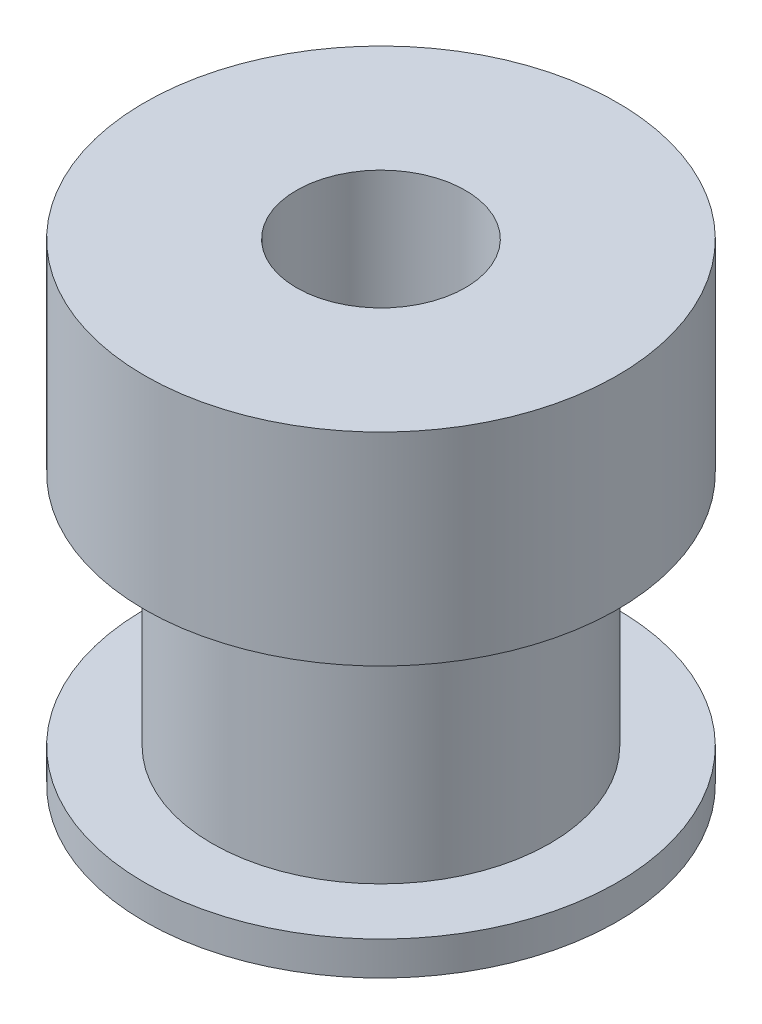
ISO-10303-21;
HEADER;
FILE_DESCRIPTION(('STEP AP214'),'2;1');
FILE_NAME('part.step','',(''),(''),'','','');
FILE_SCHEMA(('AUTOMOTIVE_DESIGN { 1 0 10303 214 1 1 1 1 }'));
ENDSEC;
DATA;
#1=APPLICATION_CONTEXT('core data for automotive mechanical design processes');
#2=APPLICATION_PROTOCOL_DEFINITION('international standard','automotive_design',2000,#1);
#3=PRODUCT_CONTEXT('',#1,'mechanical');
#4=PRODUCT('Part','Part','',(#3));
#5=PRODUCT_RELATED_PRODUCT_CATEGORY('part','',(#4));
#6=PRODUCT_DEFINITION_FORMATION('','',#4);
#7=PRODUCT_DEFINITION_CONTEXT('part definition',#1,'design');
#8=PRODUCT_DEFINITION('design','',#6,#7);
#9=PRODUCT_DEFINITION_SHAPE('','',#8);
#10=(LENGTH_UNIT() NAMED_UNIT(*) SI_UNIT(.MILLI.,.METRE.));
#11=(NAMED_UNIT(*) PLANE_ANGLE_UNIT() SI_UNIT($,.RADIAN.));
#12=(NAMED_UNIT(*) SI_UNIT($,.STERADIAN.) SOLID_ANGLE_UNIT());
#13=UNCERTAINTY_MEASURE_WITH_UNIT(LENGTH_MEASURE(1.E-05),#10,'distance_accuracy_value','');
#14=(GEOMETRIC_REPRESENTATION_CONTEXT(3) GLOBAL_UNCERTAINTY_ASSIGNED_CONTEXT((#13)) GLOBAL_UNIT_ASSIGNED_CONTEXT((#10,
#11,#12)) REPRESENTATION_CONTEXT('',''));
#15=CARTESIAN_POINT('',(0.,0.,0.));
#16=DIRECTION('',(0.,0.,1.));
#17=DIRECTION('',(1.,0.,0.));
#18=AXIS2_PLACEMENT_3D('',#15,#16,#17);
#19=CARTESIAN_POINT('',(0.,1.,0.));
#20=DIRECTION('',(0.,-1.,0.));
#21=DIRECTION('',(0.,0.,-1.));
#22=AXIS2_PLACEMENT_3D('',#19,#20,#21);
#23=CYLINDRICAL_SURFACE('',#22,7.);
#24=CARTESIAN_POINT('',(0.,1.,0.));
#25=DIRECTION('',(0.,1.,0.));
#26=DIRECTION('',(0.,0.,1.));
#27=AXIS2_PLACEMENT_3D('',#24,#25,#26);
#28=CIRCLE('',#27,7.);
#29=CARTESIAN_POINT('',(0.,1.,7.));
#30=VERTEX_POINT('',#29);
#31=EDGE_CURVE('E45',#30,#30,#28,.T.);
#32=ORIENTED_EDGE('',*,*,#31,.F.);
#33=EDGE_LOOP('',(#32));
#34=FACE_BOUND('',#33,.T.);
#35=CARTESIAN_POINT('',(0.,0.,0.));
#36=DIRECTION('',(0.,1.,0.));
#37=DIRECTION('',(0.,0.,1.));
#38=AXIS2_PLACEMENT_3D('',#35,#36,#37);
#39=CIRCLE('',#38,7.);
#40=CARTESIAN_POINT('',(0.,0.,7.));
#41=VERTEX_POINT('',#40);
#42=EDGE_CURVE('E40',#41,#41,#39,.T.);
#43=ORIENTED_EDGE('',*,*,#42,.T.);
#44=EDGE_LOOP('',(#43));
#45=FACE_BOUND('',#44,.T.);
#46=ADVANCED_FACE('F37',(#34,#45),#23,.T.);
#47=CARTESIAN_POINT('',(0.,1.,0.));
#48=DIRECTION('',(0.,1.,0.));
#49=DIRECTION('',(0.,0.,1.));
#50=AXIS2_PLACEMENT_3D('',#47,#48,#49);
#51=PLANE('',#50);
#52=CARTESIAN_POINT('',(0.,1.,0.));
#53=DIRECTION('',(0.,1.,0.));
#54=DIRECTION('',(0.,0.,1.));
#55=AXIS2_PLACEMENT_3D('',#52,#53,#54);
#56=CIRCLE('',#55,5.);
#57=CARTESIAN_POINT('',(0.,1.,5.));
#58=VERTEX_POINT('',#57);
#59=EDGE_CURVE('E10',#58,#58,#56,.T.);
#60=ORIENTED_EDGE('',*,*,#59,.F.);
#61=EDGE_LOOP('',(#60));
#62=FACE_BOUND('',#61,.T.);
#63=ORIENTED_EDGE('',*,*,#31,.T.);
#64=EDGE_LOOP('',(#63));
#65=FACE_BOUND('',#64,.T.);
#66=ADVANCED_FACE('F98',(#62,#65),#51,.T.);
#67=CARTESIAN_POINT('',(0.,0.,0.));
#68=DIRECTION('',(0.,1.,0.));
#69=DIRECTION('',(0.,0.,1.));
#70=AXIS2_PLACEMENT_3D('',#67,#68,#69);
#71=PLANE('',#70);
#72=CARTESIAN_POINT('',(0.,0.,0.));
#73=DIRECTION('',(0.,1.,0.));
#74=DIRECTION('',(0.,0.,1.));
#75=AXIS2_PLACEMENT_3D('',#72,#73,#74);
#76=CIRCLE('',#75,2.5);
#77=CARTESIAN_POINT('',(0.,0.,2.5));
#78=VERTEX_POINT('',#77);
#79=EDGE_CURVE('E61',#78,#78,#76,.F.);
#80=ORIENTED_EDGE('',*,*,#79,.F.);
#81=EDGE_LOOP('',(#80));
#82=FACE_BOUND('',#81,.T.);
#83=ORIENTED_EDGE('',*,*,#42,.F.);
#84=EDGE_LOOP('',(#83));
#85=FACE_BOUND('',#84,.T.);
#86=ADVANCED_FACE('F103',(#82,#85),#71,.F.);
#87=CARTESIAN_POINT('',(0.,8.,0.));
#88=DIRECTION('',(0.,-1.,0.));
#89=DIRECTION('',(0.,0.,-1.));
#90=AXIS2_PLACEMENT_3D('',#87,#88,#89);
#91=CYLINDRICAL_SURFACE('',#90,5.);
#92=CARTESIAN_POINT('',(0.,8.,0.));
#93=DIRECTION('',(0.,1.,0.));
#94=DIRECTION('',(0.,0.,1.));
#95=AXIS2_PLACEMENT_3D('',#92,#93,#94);
#96=CIRCLE('',#95,5.);
#97=CARTESIAN_POINT('',(0.,8.,5.));
#98=VERTEX_POINT('',#97);
#99=EDGE_CURVE('E52',#98,#98,#96,.T.);
#100=ORIENTED_EDGE('',*,*,#99,.F.);
#101=EDGE_LOOP('',(#100));
#102=FACE_BOUND('',#101,.T.);
#103=ORIENTED_EDGE('',*,*,#59,.T.);
#104=EDGE_LOOP('',(#103));
#105=FACE_BOUND('',#104,.T.);
#106=ADVANCED_FACE('F85',(#102,#105),#91,.T.);
#107=CARTESIAN_POINT('',(0.,14.,0.));
#108=DIRECTION('',(0.,-1.,0.));
#109=DIRECTION('',(0.,0.,-1.));
#110=AXIS2_PLACEMENT_3D('',#107,#108,#109);
#111=CYLINDRICAL_SURFACE('',#110,7.);
#112=CARTESIAN_POINT('',(0.,14.,0.));
#113=DIRECTION('',(0.,1.,0.));
#114=DIRECTION('',(0.,0.,1.));
#115=AXIS2_PLACEMENT_3D('',#112,#113,#114);
#116=CIRCLE('',#115,7.);
#117=CARTESIAN_POINT('',(0.,14.,7.));
#118=VERTEX_POINT('',#117);
#119=EDGE_CURVE('E56',#118,#118,#116,.T.);
#120=ORIENTED_EDGE('',*,*,#119,.F.);
#121=EDGE_LOOP('',(#120));
#122=FACE_BOUND('',#121,.T.);
#123=CARTESIAN_POINT('',(0.,8.,0.));
#124=DIRECTION('',(0.,1.,0.));
#125=DIRECTION('',(0.,0.,1.));
#126=AXIS2_PLACEMENT_3D('',#123,#124,#125);
#127=CIRCLE('',#126,7.);
#128=CARTESIAN_POINT('',(0.,8.,7.));
#129=VERTEX_POINT('',#128);
#130=EDGE_CURVE('E57',#129,#129,#127,.T.);
#131=ORIENTED_EDGE('',*,*,#130,.T.);
#132=EDGE_LOOP('',(#131));
#133=FACE_BOUND('',#132,.T.);
#134=ADVANCED_FACE('F79',(#122,#133),#111,.T.);
#135=CARTESIAN_POINT('',(0.,14.,0.));
#136=DIRECTION('',(0.,1.,0.));
#137=DIRECTION('',(0.,0.,1.));
#138=AXIS2_PLACEMENT_3D('',#135,#136,#137);
#139=PLANE('',#138);
#140=CARTESIAN_POINT('',(0.,14.,0.));
#141=DIRECTION('',(0.,1.,0.));
#142=DIRECTION('',(0.,0.,1.));
#143=AXIS2_PLACEMENT_3D('',#140,#141,#142);
#144=CIRCLE('',#143,2.5);
#145=CARTESIAN_POINT('',(0.,14.,2.5));
#146=VERTEX_POINT('',#145);
#147=EDGE_CURVE('E68',#146,#146,#144,.T.);
#148=ORIENTED_EDGE('',*,*,#147,.F.);
#149=EDGE_LOOP('',(#148));
#150=FACE_BOUND('',#149,.T.);
#151=ORIENTED_EDGE('',*,*,#119,.T.);
#152=EDGE_LOOP('',(#151));
#153=FACE_BOUND('',#152,.T.);
#154=ADVANCED_FACE('F75',(#150,#153),#139,.T.);
#155=CARTESIAN_POINT('',(0.,8.,0.));
#156=DIRECTION('',(0.,1.,0.));
#157=DIRECTION('',(0.,0.,1.));
#158=AXIS2_PLACEMENT_3D('',#155,#156,#157);
#159=PLANE('',#158);
#160=ORIENTED_EDGE('',*,*,#99,.T.);
#161=EDGE_LOOP('',(#160));
#162=FACE_BOUND('',#161,.T.);
#163=ORIENTED_EDGE('',*,*,#130,.F.);
#164=EDGE_LOOP('',(#163));
#165=FACE_BOUND('',#164,.T.);
#166=ADVANCED_FACE('F78',(#162,#165),#159,.F.);
#167=CARTESIAN_POINT('',(0.,-7.07106781186548,0.));
#168=DIRECTION('',(0.,1.,0.));
#169=DIRECTION('',(0.,0.,1.));
#170=AXIS2_PLACEMENT_3D('',#167,#168,#169);
#171=CYLINDRICAL_SURFACE('',#170,2.5);
#172=ORIENTED_EDGE('',*,*,#79,.T.);
#173=EDGE_LOOP('',(#172));
#174=FACE_BOUND('',#173,.T.);
#175=ORIENTED_EDGE('',*,*,#147,.T.);
#176=EDGE_LOOP('',(#175));
#177=FACE_BOUND('',#176,.T.);
#178=ADVANCED_FACE('F73',(#174,#177),#171,.F.);
#179=CLOSED_SHELL('',(#46,#66,#86,#106,#134,#154,#166,#178));
#180=MANIFOLD_SOLID_BREP('B2',#179);
#181=ADVANCED_BREP_SHAPE_REPRESENTATION('',(#18,#180),#14);
#182=SHAPE_DEFINITION_REPRESENTATION(#9,#181);
ENDSEC;
END-ISO-10303-21;
